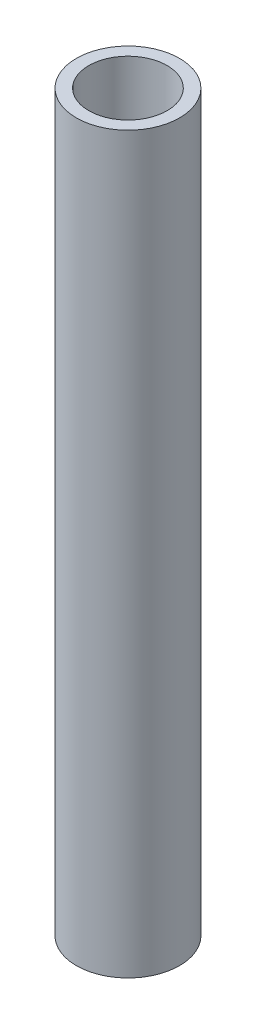
ISO-10303-21;
HEADER;
FILE_DESCRIPTION(('STEP AP214'),'2;1');
FILE_NAME('part.step','',(''),(''),'','','');
FILE_SCHEMA(('AUTOMOTIVE_DESIGN { 1 0 10303 214 1 1 1 1 }'));
ENDSEC;
DATA;
#1=APPLICATION_CONTEXT('core data for automotive mechanical design processes');
#2=APPLICATION_PROTOCOL_DEFINITION('international standard','automotive_design',2000,#1);
#3=PRODUCT_CONTEXT('',#1,'mechanical');
#4=PRODUCT('Part','Part','',(#3));
#5=PRODUCT_RELATED_PRODUCT_CATEGORY('part','',(#4));
#6=PRODUCT_DEFINITION_FORMATION('','',#4);
#7=PRODUCT_DEFINITION_CONTEXT('part definition',#1,'design');
#8=PRODUCT_DEFINITION('design','',#6,#7);
#9=PRODUCT_DEFINITION_SHAPE('','',#8);
#10=(LENGTH_UNIT() NAMED_UNIT(*) SI_UNIT(.MILLI.,.METRE.));
#11=(NAMED_UNIT(*) PLANE_ANGLE_UNIT() SI_UNIT($,.RADIAN.));
#12=(NAMED_UNIT(*) SI_UNIT($,.STERADIAN.) SOLID_ANGLE_UNIT());
#13=UNCERTAINTY_MEASURE_WITH_UNIT(LENGTH_MEASURE(1.E-05),#10,'distance_accuracy_value','');
#14=(GEOMETRIC_REPRESENTATION_CONTEXT(3) GLOBAL_UNCERTAINTY_ASSIGNED_CONTEXT((#13)) GLOBAL_UNIT_ASSIGNED_CONTEXT((#10,
#11,#12)) REPRESENTATION_CONTEXT('',''));
#15=CARTESIAN_POINT('',(0.,0.,0.));
#16=DIRECTION('',(0.,0.,1.));
#17=DIRECTION('',(1.,0.,0.));
#18=AXIS2_PLACEMENT_3D('',#15,#16,#17);
#19=CARTESIAN_POINT('',(0.,15.,0.));
#20=DIRECTION('',(0.,1.,0.));
#21=DIRECTION('',(0.,0.,1.));
#22=AXIS2_PLACEMENT_3D('',#19,#20,#21);
#23=PLANE('',#22);
#24=CARTESIAN_POINT('',(0.,15.,0.));
#25=DIRECTION('',(0.,1.,0.));
#26=DIRECTION('',(0.,0.,1.));
#27=AXIS2_PLACEMENT_3D('',#24,#25,#26);
#28=CIRCLE('',#27,1.054);
#29=CARTESIAN_POINT('',(0.,15.,1.054));
#30=VERTEX_POINT('',#29);
#31=EDGE_CURVE('E10',#30,#30,#28,.T.);
#32=ORIENTED_EDGE('',*,*,#31,.T.);
#33=EDGE_LOOP('',(#32));
#34=FACE_BOUND('',#33,.T.);
#35=CARTESIAN_POINT('',(0.,15.,0.));
#36=DIRECTION('',(0.,1.,0.));
#37=DIRECTION('',(0.,0.,1.));
#38=AXIS2_PLACEMENT_3D('',#35,#36,#37);
#39=CIRCLE('',#38,0.8);
#40=CARTESIAN_POINT('',(0.,15.,0.8));
#41=VERTEX_POINT('',#40);
#42=EDGE_CURVE('E42',#41,#41,#39,.T.);
#43=ORIENTED_EDGE('',*,*,#42,.F.);
#44=EDGE_LOOP('',(#43));
#45=FACE_BOUND('',#44,.T.);
#46=ADVANCED_FACE('F31',(#34,#45),#23,.T.);
#47=CARTESIAN_POINT('',(0.,0.,0.));
#48=DIRECTION('',(0.,1.,0.));
#49=DIRECTION('',(0.,0.,1.));
#50=AXIS2_PLACEMENT_3D('',#47,#48,#49);
#51=PLANE('',#50);
#52=CARTESIAN_POINT('',(0.,0.,0.));
#53=DIRECTION('',(0.,1.,0.));
#54=DIRECTION('',(0.,0.,1.));
#55=AXIS2_PLACEMENT_3D('',#52,#53,#54);
#56=CIRCLE('',#55,1.054);
#57=CARTESIAN_POINT('',(0.,0.,1.054));
#58=VERTEX_POINT('',#57);
#59=EDGE_CURVE('E35',#58,#58,#56,.T.);
#60=ORIENTED_EDGE('',*,*,#59,.F.);
#61=EDGE_LOOP('',(#60));
#62=FACE_BOUND('',#61,.T.);
#63=CARTESIAN_POINT('',(0.,0.,0.));
#64=DIRECTION('',(0.,1.,0.));
#65=DIRECTION('',(0.,0.,1.));
#66=AXIS2_PLACEMENT_3D('',#63,#64,#65);
#67=CIRCLE('',#66,0.8);
#68=CARTESIAN_POINT('',(0.,0.,0.8));
#69=VERTEX_POINT('',#68);
#70=EDGE_CURVE('E44',#69,#69,#67,.T.);
#71=ORIENTED_EDGE('',*,*,#70,.T.);
#72=EDGE_LOOP('',(#71));
#73=FACE_BOUND('',#72,.T.);
#74=ADVANCED_FACE('F54',(#62,#73),#51,.F.);
#75=CARTESIAN_POINT('',(0.,15.,0.));
#76=DIRECTION('',(0.,-1.,0.));
#77=DIRECTION('',(0.,0.,-1.));
#78=AXIS2_PLACEMENT_3D('',#75,#76,#77);
#79=CYLINDRICAL_SURFACE('',#78,1.054);
#80=ORIENTED_EDGE('',*,*,#31,.F.);
#81=EDGE_LOOP('',(#80));
#82=FACE_BOUND('',#81,.T.);
#83=ORIENTED_EDGE('',*,*,#59,.T.);
#84=EDGE_LOOP('',(#83));
#85=FACE_BOUND('',#84,.T.);
#86=ADVANCED_FACE('F33',(#82,#85),#79,.T.);
#87=CARTESIAN_POINT('',(0.,15.,0.));
#88=DIRECTION('',(0.,-1.,0.));
#89=DIRECTION('',(0.,0.,-1.));
#90=AXIS2_PLACEMENT_3D('',#87,#88,#89);
#91=CYLINDRICAL_SURFACE('',#90,0.8);
#92=ORIENTED_EDGE('',*,*,#42,.T.);
#93=EDGE_LOOP('',(#92));
#94=FACE_BOUND('',#93,.T.);
#95=ORIENTED_EDGE('',*,*,#70,.F.);
#96=EDGE_LOOP('',(#95));
#97=FACE_BOUND('',#96,.T.);
#98=ADVANCED_FACE('F50',(#94,#97),#91,.F.);
#99=CLOSED_SHELL('',(#46,#74,#86,#98));
#100=MANIFOLD_SOLID_BREP('B2',#99);
#101=ADVANCED_BREP_SHAPE_REPRESENTATION('',(#18,#100),#14);
#102=SHAPE_DEFINITION_REPRESENTATION(#9,#101);
ENDSEC;
END-ISO-10303-21;
